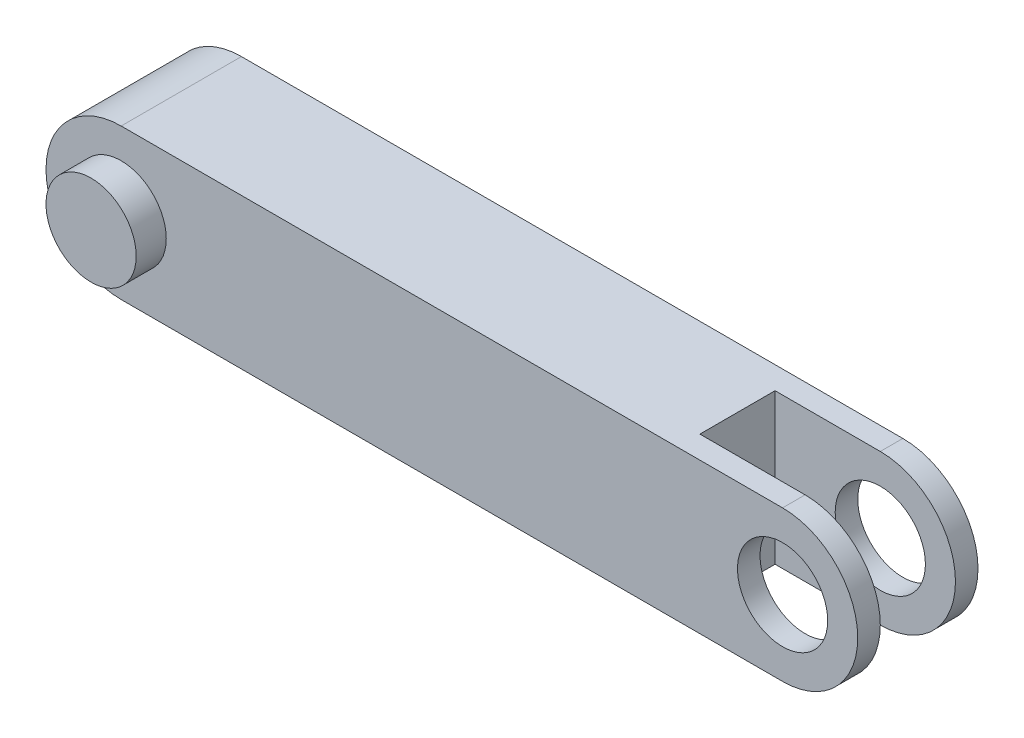
ISO-10303-21;
HEADER;
FILE_DESCRIPTION(('STEP AP214'),'2;1');
FILE_NAME('part.step','',(''),(''),'','','');
FILE_SCHEMA(('AUTOMOTIVE_DESIGN { 1 0 10303 214 1 1 1 1 }'));
ENDSEC;
DATA;
#1=APPLICATION_CONTEXT('core data for automotive mechanical design processes');
#2=APPLICATION_PROTOCOL_DEFINITION('international standard','automotive_design',2000,#1);
#3=PRODUCT_CONTEXT('',#1,'mechanical');
#4=PRODUCT('Part','Part','',(#3));
#5=PRODUCT_RELATED_PRODUCT_CATEGORY('part','',(#4));
#6=PRODUCT_DEFINITION_FORMATION('','',#4);
#7=PRODUCT_DEFINITION_CONTEXT('part definition',#1,'design');
#8=PRODUCT_DEFINITION('design','',#6,#7);
#9=PRODUCT_DEFINITION_SHAPE('','',#8);
#10=(LENGTH_UNIT() NAMED_UNIT(*) SI_UNIT(.MILLI.,.METRE.));
#11=(NAMED_UNIT(*) PLANE_ANGLE_UNIT() SI_UNIT($,.RADIAN.));
#12=(NAMED_UNIT(*) SI_UNIT($,.STERADIAN.) SOLID_ANGLE_UNIT());
#13=UNCERTAINTY_MEASURE_WITH_UNIT(LENGTH_MEASURE(1.E-05),#10,'distance_accuracy_value','');
#14=(GEOMETRIC_REPRESENTATION_CONTEXT(3) GLOBAL_UNCERTAINTY_ASSIGNED_CONTEXT((#13)) GLOBAL_UNIT_ASSIGNED_CONTEXT((#10,
#11,#12)) REPRESENTATION_CONTEXT('',''));
#15=CARTESIAN_POINT('',(0.,0.,0.));
#16=DIRECTION('',(0.,0.,1.));
#17=DIRECTION('',(1.,0.,0.));
#18=AXIS2_PLACEMENT_3D('',#15,#16,#17);
#19=CARTESIAN_POINT('',(164.496323318205,0.,40.));
#20=DIRECTION('',(0.,0.,-1.));
#21=DIRECTION('',(-1.,0.,0.));
#22=AXIS2_PLACEMENT_3D('',#19,#20,#21);
#23=CYLINDRICAL_SURFACE('',#22,25.);
#24=DIRECTION('',(0.,0.,-1.));
#25=VECTOR('',#24,1.);
#26=CARTESIAN_POINT('',(164.496323318205,25.,40.));
#27=LINE('',#26,#25);
#28=CARTESIAN_POINT('',(164.496323318205,25.,7.49999999999998));
#29=VERTEX_POINT('',#28);
#30=CARTESIAN_POINT('',(164.496323318205,25.,0.));
#31=VERTEX_POINT('',#30);
#32=EDGE_CURVE('E166',#29,#31,#27,.T.);
#33=ORIENTED_EDGE('',*,*,#32,.F.);
#34=CARTESIAN_POINT('',(164.496323318205,0.,7.49999999999999));
#35=DIRECTION('',(0.,0.,-1.));
#36=DIRECTION('',(-1.,0.,0.));
#37=AXIS2_PLACEMENT_3D('',#34,#35,#36);
#38=CIRCLE('',#37,25.);
#39=CARTESIAN_POINT('',(164.496323318205,-25.,7.49999999999998));
#40=VERTEX_POINT('',#39);
#41=EDGE_CURVE('E137',#29,#40,#38,.T.);
#42=ORIENTED_EDGE('',*,*,#41,.T.);
#43=DIRECTION('',(0.,0.,-1.));
#44=VECTOR('',#43,1.);
#45=CARTESIAN_POINT('',(164.496323318205,-25.,40.));
#46=LINE('',#45,#44);
#47=CARTESIAN_POINT('',(164.496323318205,-25.,0.));
#48=VERTEX_POINT('',#47);
#49=EDGE_CURVE('E170',#40,#48,#46,.T.);
#50=ORIENTED_EDGE('',*,*,#49,.T.);
#51=CARTESIAN_POINT('',(164.496323318205,0.,0.));
#52=DIRECTION('',(0.,0.,1.));
#53=DIRECTION('',(1.,0.,0.));
#54=AXIS2_PLACEMENT_3D('',#51,#52,#53);
#55=CIRCLE('',#54,25.);
#56=EDGE_CURVE('E161',#48,#31,#55,.T.);
#57=ORIENTED_EDGE('',*,*,#56,.T.);
#58=EDGE_LOOP('',(#33,#42,#50,#57));
#59=FACE_BOUND('',#58,.T.);
#60=ADVANCED_FACE('F31',(#59),#23,.T.);
#61=CARTESIAN_POINT('',(-55.5036766817947,0.,0.));
#62=DIRECTION('',(0.,0.,1.));
#63=DIRECTION('',(1.,0.,0.));
#64=AXIS2_PLACEMENT_3D('',#61,#62,#63);
#65=PLANE('',#64);
#66=CARTESIAN_POINT('',(164.496323318205,0.,0.));
#67=DIRECTION('',(0.,0.,1.));
#68=DIRECTION('',(1.,0.,0.));
#69=AXIS2_PLACEMENT_3D('',#66,#67,#68);
#70=CIRCLE('',#69,15.);
#71=CARTESIAN_POINT('',(179.496323318205,0.,0.));
#72=VERTEX_POINT('',#71);
#73=EDGE_CURVE('E130',#72,#72,#70,.T.);
#74=ORIENTED_EDGE('',*,*,#73,.T.);
#75=EDGE_LOOP('',(#74));
#76=FACE_BOUND('',#75,.T.);
#77=CARTESIAN_POINT('',(-55.5036766817947,0.,0.));
#78=DIRECTION('',(0.,0.,1.));
#79=DIRECTION('',(1.,0.,0.));
#80=AXIS2_PLACEMENT_3D('',#77,#78,#79);
#81=CIRCLE('',#80,25.);
#82=CARTESIAN_POINT('',(-55.5036766817947,25.,0.));
#83=VERTEX_POINT('',#82);
#84=CARTESIAN_POINT('',(-55.5036766817947,-25.,0.));
#85=VERTEX_POINT('',#84);
#86=EDGE_CURVE('E146',#83,#85,#81,.T.);
#87=ORIENTED_EDGE('',*,*,#86,.F.);
#88=DIRECTION('',(-1.,0.,0.));
#89=VECTOR('',#88,1.);
#90=CARTESIAN_POINT('',(-55.5036766817947,25.,0.));
#91=LINE('',#90,#89);
#92=EDGE_CURVE('E76',#31,#83,#91,.T.);
#93=ORIENTED_EDGE('',*,*,#92,.F.);
#94=ORIENTED_EDGE('',*,*,#56,.F.);
#95=DIRECTION('',(1.,0.,0.));
#96=VECTOR('',#95,1.);
#97=CARTESIAN_POINT('',(-55.5036766817947,-25.,0.));
#98=LINE('',#97,#96);
#99=EDGE_CURVE('E158',#85,#48,#98,.T.);
#100=ORIENTED_EDGE('',*,*,#99,.F.);
#101=EDGE_LOOP('',(#87,#93,#94,#100));
#102=FACE_BOUND('',#101,.T.);
#103=CARTESIAN_POINT('',(-55.5036766817947,0.,0.));
#104=DIRECTION('',(0.,0.,1.));
#105=DIRECTION('',(1.,0.,0.));
#106=AXIS2_PLACEMENT_3D('',#103,#104,#105);
#107=CIRCLE('',#106,15.);
#108=CARTESIAN_POINT('',(-40.5036766817947,0.,0.));
#109=VERTEX_POINT('',#108);
#110=EDGE_CURVE('E40',#109,#109,#107,.F.);
#111=ORIENTED_EDGE('',*,*,#110,.F.);
#112=EDGE_LOOP('',(#111));
#113=FACE_BOUND('',#112,.T.);
#114=ADVANCED_FACE('F180',(#76,#102,#113),#65,.F.);
#115=CARTESIAN_POINT('',(-55.5036766817947,0.,40.));
#116=DIRECTION('',(0.,0.,1.));
#117=DIRECTION('',(1.,0.,0.));
#118=AXIS2_PLACEMENT_3D('',#115,#116,#117);
#119=PLANE('',#118);
#120=CARTESIAN_POINT('',(164.496323318205,0.,40.));
#121=DIRECTION('',(0.,0.,1.));
#122=DIRECTION('',(1.,0.,0.));
#123=AXIS2_PLACEMENT_3D('',#120,#121,#122);
#124=CIRCLE('',#123,15.);
#125=CARTESIAN_POINT('',(179.496323318205,0.,40.));
#126=VERTEX_POINT('',#125);
#127=EDGE_CURVE('E261',#126,#126,#124,.T.);
#128=ORIENTED_EDGE('',*,*,#127,.F.);
#129=EDGE_LOOP('',(#128));
#130=FACE_BOUND('',#129,.T.);
#131=CARTESIAN_POINT('',(-55.5036766817947,0.,40.));
#132=DIRECTION('',(0.,0.,1.));
#133=DIRECTION('',(1.,0.,0.));
#134=AXIS2_PLACEMENT_3D('',#131,#132,#133);
#135=CIRCLE('',#134,25.);
#136=CARTESIAN_POINT('',(-55.5036766817947,25.,40.));
#137=VERTEX_POINT('',#136);
#138=CARTESIAN_POINT('',(-55.5036766817947,-25.,40.));
#139=VERTEX_POINT('',#138);
#140=EDGE_CURVE('E149',#137,#139,#135,.T.);
#141=ORIENTED_EDGE('',*,*,#140,.T.);
#142=DIRECTION('',(1.,0.,0.));
#143=VECTOR('',#142,1.);
#144=CARTESIAN_POINT('',(-55.5036766817947,-25.,40.));
#145=LINE('',#144,#143);
#146=CARTESIAN_POINT('',(164.496323318205,-25.,40.));
#147=VERTEX_POINT('',#146);
#148=EDGE_CURVE('E84',#139,#147,#145,.T.);
#149=ORIENTED_EDGE('',*,*,#148,.T.);
#150=CARTESIAN_POINT('',(164.496323318205,0.,40.));
#151=DIRECTION('',(0.,0.,1.));
#152=DIRECTION('',(1.,0.,0.));
#153=AXIS2_PLACEMENT_3D('',#150,#151,#152);
#154=CIRCLE('',#153,25.);
#155=CARTESIAN_POINT('',(164.496323318205,25.,40.));
#156=VERTEX_POINT('',#155);
#157=EDGE_CURVE('E152',#147,#156,#154,.T.);
#158=ORIENTED_EDGE('',*,*,#157,.T.);
#159=DIRECTION('',(-1.,0.,0.));
#160=VECTOR('',#159,1.);
#161=CARTESIAN_POINT('',(-55.5036766817947,25.,40.));
#162=LINE('',#161,#160);
#163=EDGE_CURVE('E56',#156,#137,#162,.T.);
#164=ORIENTED_EDGE('',*,*,#163,.T.);
#165=EDGE_LOOP('',(#141,#149,#158,#164));
#166=FACE_BOUND('',#165,.T.);
#167=CARTESIAN_POINT('',(-55.5036766817947,0.,40.));
#168=DIRECTION('',(0.,0.,1.));
#169=DIRECTION('',(1.,0.,0.));
#170=AXIS2_PLACEMENT_3D('',#167,#168,#169);
#171=CIRCLE('',#170,15.);
#172=CARTESIAN_POINT('',(-40.5036766817947,0.,40.));
#173=VERTEX_POINT('',#172);
#174=EDGE_CURVE('E142',#173,#173,#171,.T.);
#175=ORIENTED_EDGE('',*,*,#174,.F.);
#176=EDGE_LOOP('',(#175));
#177=FACE_BOUND('',#176,.T.);
#178=ADVANCED_FACE('F182',(#130,#166,#177),#119,.T.);
#179=CARTESIAN_POINT('',(-55.5036766817947,0.,40.));
#180=DIRECTION('',(0.,0.,-1.));
#181=DIRECTION('',(-1.,0.,0.));
#182=AXIS2_PLACEMENT_3D('',#179,#180,#181);
#183=CYLINDRICAL_SURFACE('',#182,25.);
#184=ORIENTED_EDGE('',*,*,#86,.T.);
#185=DIRECTION('',(0.,0.,-1.));
#186=VECTOR('',#185,1.);
#187=CARTESIAN_POINT('',(-55.5036766817947,-25.,40.));
#188=LINE('',#187,#186);
#189=EDGE_CURVE('E173',#139,#85,#188,.T.);
#190=ORIENTED_EDGE('',*,*,#189,.F.);
#191=ORIENTED_EDGE('',*,*,#140,.F.);
#192=DIRECTION('',(0.,0.,-1.));
#193=VECTOR('',#192,1.);
#194=CARTESIAN_POINT('',(-55.5036766817947,25.,40.));
#195=LINE('',#194,#193);
#196=EDGE_CURVE('E155',#137,#83,#195,.T.);
#197=ORIENTED_EDGE('',*,*,#196,.T.);
#198=EDGE_LOOP('',(#184,#190,#191,#197));
#199=FACE_BOUND('',#198,.T.);
#200=ADVANCED_FACE('F33',(#199),#183,.T.);
#201=CARTESIAN_POINT('',(-55.5036766817947,-25.,40.));
#202=DIRECTION('',(0.,1.,0.));
#203=DIRECTION('',(0.,0.,1.));
#204=AXIS2_PLACEMENT_3D('',#201,#202,#203);
#205=PLANE('',#204);
#206=ORIENTED_EDGE('',*,*,#49,.F.);
#207=DIRECTION('',(-1.,0.,0.));
#208=VECTOR('',#207,1.);
#209=CARTESIAN_POINT('',(129.496323318205,-25.,7.49999999999998));
#210=LINE('',#209,#208);
#211=CARTESIAN_POINT('',(129.496323318205,-25.,7.49999999999998));
#212=VERTEX_POINT('',#211);
#213=EDGE_CURVE('E115',#40,#212,#210,.T.);
#214=ORIENTED_EDGE('',*,*,#213,.T.);
#215=DIRECTION('',(0.,0.,1.));
#216=VECTOR('',#215,1.);
#217=CARTESIAN_POINT('',(129.496323318205,-25.,7.49999999999998));
#218=LINE('',#217,#216);
#219=CARTESIAN_POINT('',(129.496323318205,-25.,32.5));
#220=VERTEX_POINT('',#219);
#221=EDGE_CURVE('E109',#212,#220,#218,.T.);
#222=ORIENTED_EDGE('',*,*,#221,.T.);
#223=DIRECTION('',(1.,0.,0.));
#224=VECTOR('',#223,1.);
#225=CARTESIAN_POINT('',(129.496323318205,-25.,32.5));
#226=LINE('',#225,#224);
#227=CARTESIAN_POINT('',(164.496323318205,-25.,32.5));
#228=VERTEX_POINT('',#227);
#229=EDGE_CURVE('E118',#220,#228,#226,.T.);
#230=ORIENTED_EDGE('',*,*,#229,.T.);
#231=EDGE_CURVE('E171',#147,#228,#46,.T.);
#232=ORIENTED_EDGE('',*,*,#231,.F.);
#233=ORIENTED_EDGE('',*,*,#148,.F.);
#234=ORIENTED_EDGE('',*,*,#189,.T.);
#235=ORIENTED_EDGE('',*,*,#99,.T.);
#236=EDGE_LOOP('',(#206,#214,#222,#230,#232,#233,#234,#235));
#237=FACE_BOUND('',#236,.T.);
#238=ADVANCED_FACE('F124',(#237),#205,.F.);
#239=CARTESIAN_POINT('',(164.496323318205,0.,32.5));
#240=DIRECTION('',(0.,0.,1.));
#241=DIRECTION('',(1.,0.,0.));
#242=AXIS2_PLACEMENT_3D('',#239,#240,#241);
#243=CIRCLE('',#242,25.);
#244=CARTESIAN_POINT('',(164.496323318205,25.,32.5));
#245=VERTEX_POINT('',#244);
#246=EDGE_CURVE('E120',#228,#245,#243,.T.);
#247=ORIENTED_EDGE('',*,*,#246,.T.);
#248=EDGE_CURVE('E167',#156,#245,#27,.T.);
#249=ORIENTED_EDGE('',*,*,#248,.F.);
#250=ORIENTED_EDGE('',*,*,#157,.F.);
#251=ORIENTED_EDGE('',*,*,#231,.T.);
#252=EDGE_LOOP('',(#247,#249,#250,#251));
#253=FACE_BOUND('',#252,.T.);
#254=ADVANCED_FACE('F193',(#253),#23,.T.);
#255=CARTESIAN_POINT('',(-55.5036766817947,25.,40.));
#256=DIRECTION('',(0.,-1.,0.));
#257=DIRECTION('',(0.,0.,-1.));
#258=AXIS2_PLACEMENT_3D('',#255,#256,#257);
#259=PLANE('',#258);
#260=DIRECTION('',(0.,0.,1.));
#261=VECTOR('',#260,1.);
#262=CARTESIAN_POINT('',(129.496323318205,25.,7.49999999999998));
#263=LINE('',#262,#261);
#264=CARTESIAN_POINT('',(129.496323318205,25.,7.49999999999998));
#265=VERTEX_POINT('',#264);
#266=CARTESIAN_POINT('',(129.496323318205,25.,32.5));
#267=VERTEX_POINT('',#266);
#268=EDGE_CURVE('E47',#265,#267,#263,.T.);
#269=ORIENTED_EDGE('',*,*,#268,.F.);
#270=DIRECTION('',(1.,0.,0.));
#271=VECTOR('',#270,1.);
#272=CARTESIAN_POINT('',(-55.5036766817947,25.,7.49999999999999));
#273=LINE('',#272,#271);
#274=EDGE_CURVE('E11',#265,#29,#273,.T.);
#275=ORIENTED_EDGE('',*,*,#274,.T.);
#276=ORIENTED_EDGE('',*,*,#32,.T.);
#277=ORIENTED_EDGE('',*,*,#92,.T.);
#278=ORIENTED_EDGE('',*,*,#196,.F.);
#279=ORIENTED_EDGE('',*,*,#163,.F.);
#280=ORIENTED_EDGE('',*,*,#248,.T.);
#281=DIRECTION('',(1.,0.,0.));
#282=VECTOR('',#281,1.);
#283=CARTESIAN_POINT('',(129.496323318205,25.,32.5));
#284=LINE('',#283,#282);
#285=EDGE_CURVE('E126',#267,#245,#284,.T.);
#286=ORIENTED_EDGE('',*,*,#285,.F.);
#287=EDGE_LOOP('',(#269,#275,#276,#277,#278,#279,#280,#286));
#288=FACE_BOUND('',#287,.T.);
#289=ADVANCED_FACE('F198',(#288),#259,.F.);
#290=CARTESIAN_POINT('',(-55.5036766817947,0.,50.));
#291=DIRECTION('',(0.,0.,-1.));
#292=DIRECTION('',(-1.,0.,0.));
#293=AXIS2_PLACEMENT_3D('',#290,#291,#292);
#294=CYLINDRICAL_SURFACE('',#293,15.);
#295=CARTESIAN_POINT('',(-55.5036766817947,0.,50.));
#296=DIRECTION('',(0.,0.,1.));
#297=DIRECTION('',(1.,0.,0.));
#298=AXIS2_PLACEMENT_3D('',#295,#296,#297);
#299=CIRCLE('',#298,15.);
#300=CARTESIAN_POINT('',(-40.5036766817947,0.,50.));
#301=VERTEX_POINT('',#300);
#302=EDGE_CURVE('E143',#301,#301,#299,.T.);
#303=ORIENTED_EDGE('',*,*,#302,.F.);
#304=EDGE_LOOP('',(#303));
#305=FACE_BOUND('',#304,.T.);
#306=ORIENTED_EDGE('',*,*,#174,.T.);
#307=EDGE_LOOP('',(#306));
#308=FACE_BOUND('',#307,.T.);
#309=ADVANCED_FACE('F200',(#305,#308),#294,.T.);
#310=CARTESIAN_POINT('',(-55.5036766817947,0.,50.));
#311=DIRECTION('',(0.,0.,1.));
#312=DIRECTION('',(1.,0.,0.));
#313=AXIS2_PLACEMENT_3D('',#310,#311,#312);
#314=PLANE('',#313);
#315=ORIENTED_EDGE('',*,*,#302,.T.);
#316=EDGE_LOOP('',(#315));
#317=FACE_BOUND('',#316,.T.);
#318=ADVANCED_FACE('F223',(#317),#314,.T.);
#319=CARTESIAN_POINT('',(-55.5036766817947,0.,-10.));
#320=DIRECTION('',(0.,0.,1.));
#321=DIRECTION('',(1.,0.,0.));
#322=AXIS2_PLACEMENT_3D('',#319,#320,#321);
#323=CYLINDRICAL_SURFACE('',#322,15.);
#324=CARTESIAN_POINT('',(-55.5036766817947,0.,-10.));
#325=DIRECTION('',(0.,0.,-1.));
#326=DIRECTION('',(-1.,0.,0.));
#327=AXIS2_PLACEMENT_3D('',#324,#325,#326);
#328=CIRCLE('',#327,15.);
#329=CARTESIAN_POINT('',(-70.5036766817947,0.,-10.));
#330=VERTEX_POINT('',#329);
#331=EDGE_CURVE('E139',#330,#330,#328,.T.);
#332=ORIENTED_EDGE('',*,*,#331,.F.);
#333=EDGE_LOOP('',(#332));
#334=FACE_BOUND('',#333,.T.);
#335=ORIENTED_EDGE('',*,*,#110,.T.);
#336=EDGE_LOOP('',(#335));
#337=FACE_BOUND('',#336,.T.);
#338=ADVANCED_FACE('F178',(#334,#337),#323,.T.);
#339=CARTESIAN_POINT('',(-55.5036766817947,0.,-10.));
#340=DIRECTION('',(0.,0.,-1.));
#341=DIRECTION('',(-1.,0.,0.));
#342=AXIS2_PLACEMENT_3D('',#339,#340,#341);
#343=PLANE('',#342);
#344=ORIENTED_EDGE('',*,*,#331,.T.);
#345=EDGE_LOOP('',(#344));
#346=FACE_BOUND('',#345,.T.);
#347=ADVANCED_FACE('F234',(#346),#343,.T.);
#348=CARTESIAN_POINT('',(129.496323318205,-25.,7.49999999999998));
#349=DIRECTION('',(0.,0.,-1.));
#350=DIRECTION('',(-1.,0.,0.));
#351=AXIS2_PLACEMENT_3D('',#348,#349,#350);
#352=PLANE('',#351);
#353=CARTESIAN_POINT('',(164.496323318205,0.,7.49999999999999));
#354=DIRECTION('',(0.,0.,-1.));
#355=DIRECTION('',(-1.,0.,0.));
#356=AXIS2_PLACEMENT_3D('',#353,#354,#355);
#357=CIRCLE('',#356,15.);
#358=CARTESIAN_POINT('',(149.496323318205,0.,7.49999999999999));
#359=VERTEX_POINT('',#358);
#360=EDGE_CURVE('E258',#359,#359,#357,.T.);
#361=ORIENTED_EDGE('',*,*,#360,.T.);
#362=EDGE_LOOP('',(#361));
#363=FACE_BOUND('',#362,.T.);
#364=ORIENTED_EDGE('',*,*,#274,.F.);
#365=DIRECTION('',(0.,1.,0.));
#366=VECTOR('',#365,1.);
#367=CARTESIAN_POINT('',(129.496323318205,-25.,7.49999999999998));
#368=LINE('',#367,#366);
#369=EDGE_CURVE('E114',#212,#265,#368,.T.);
#370=ORIENTED_EDGE('',*,*,#369,.F.);
#371=ORIENTED_EDGE('',*,*,#213,.F.);
#372=ORIENTED_EDGE('',*,*,#41,.F.);
#373=EDGE_LOOP('',(#364,#370,#371,#372));
#374=FACE_BOUND('',#373,.T.);
#375=ADVANCED_FACE('F216',(#363,#374),#352,.F.);
#376=CARTESIAN_POINT('',(129.496323318205,-25.,32.5));
#377=DIRECTION('',(0.,0.,1.));
#378=DIRECTION('',(1.,0.,0.));
#379=AXIS2_PLACEMENT_3D('',#376,#377,#378);
#380=PLANE('',#379);
#381=CARTESIAN_POINT('',(164.496323318205,0.,32.5));
#382=DIRECTION('',(0.,0.,1.));
#383=DIRECTION('',(1.,0.,0.));
#384=AXIS2_PLACEMENT_3D('',#381,#382,#383);
#385=CIRCLE('',#384,15.);
#386=CARTESIAN_POINT('',(179.496323318205,0.,32.5));
#387=VERTEX_POINT('',#386);
#388=EDGE_CURVE('E35',#387,#387,#385,.T.);
#389=ORIENTED_EDGE('',*,*,#388,.T.);
#390=EDGE_LOOP('',(#389));
#391=FACE_BOUND('',#390,.T.);
#392=ORIENTED_EDGE('',*,*,#246,.F.);
#393=ORIENTED_EDGE('',*,*,#229,.F.);
#394=DIRECTION('',(0.,1.,0.));
#395=VECTOR('',#394,1.);
#396=CARTESIAN_POINT('',(129.496323318205,-25.,32.5));
#397=LINE('',#396,#395);
#398=EDGE_CURVE('E105',#220,#267,#397,.T.);
#399=ORIENTED_EDGE('',*,*,#398,.T.);
#400=ORIENTED_EDGE('',*,*,#285,.T.);
#401=EDGE_LOOP('',(#392,#393,#399,#400));
#402=FACE_BOUND('',#401,.T.);
#403=ADVANCED_FACE('F119',(#391,#402),#380,.F.);
#404=CARTESIAN_POINT('',(129.496323318205,-25.,7.49999999999998));
#405=DIRECTION('',(-1.,0.,0.));
#406=DIRECTION('',(0.,0.,1.));
#407=AXIS2_PLACEMENT_3D('',#404,#405,#406);
#408=PLANE('',#407);
#409=ORIENTED_EDGE('',*,*,#268,.T.);
#410=ORIENTED_EDGE('',*,*,#398,.F.);
#411=ORIENTED_EDGE('',*,*,#221,.F.);
#412=ORIENTED_EDGE('',*,*,#369,.T.);
#413=EDGE_LOOP('',(#409,#410,#411,#412));
#414=FACE_BOUND('',#413,.T.);
#415=ADVANCED_FACE('F107',(#414),#408,.F.);
#416=CARTESIAN_POINT('',(164.496323318205,0.,-10.));
#417=DIRECTION('',(0.,0.,1.));
#418=DIRECTION('',(1.,0.,0.));
#419=AXIS2_PLACEMENT_3D('',#416,#417,#418);
#420=CYLINDRICAL_SURFACE('',#419,15.);
#421=ORIENTED_EDGE('',*,*,#127,.T.);
#422=EDGE_LOOP('',(#421));
#423=FACE_BOUND('',#422,.T.);
#424=ORIENTED_EDGE('',*,*,#388,.F.);
#425=EDGE_LOOP('',(#424));
#426=FACE_BOUND('',#425,.T.);
#427=ADVANCED_FACE('F241',(#423,#426),#420,.F.);
#428=ORIENTED_EDGE('',*,*,#360,.F.);
#429=EDGE_LOOP('',(#428));
#430=FACE_BOUND('',#429,.T.);
#431=ORIENTED_EDGE('',*,*,#73,.F.);
#432=EDGE_LOOP('',(#431));
#433=FACE_BOUND('',#432,.T.);
#434=ADVANCED_FACE('F248',(#430,#433),#420,.F.);
#435=CLOSED_SHELL('',(#60,#114,#178,#200,#238,#254,#289,#309,#318,#338,#347,#375,#403,#415,#427,#434));
#436=MANIFOLD_SOLID_BREP('B2',#435);
#437=ADVANCED_BREP_SHAPE_REPRESENTATION('',(#18,#436),#14);
#438=SHAPE_DEFINITION_REPRESENTATION(#9,#437);
ENDSEC;
END-ISO-10303-21;
